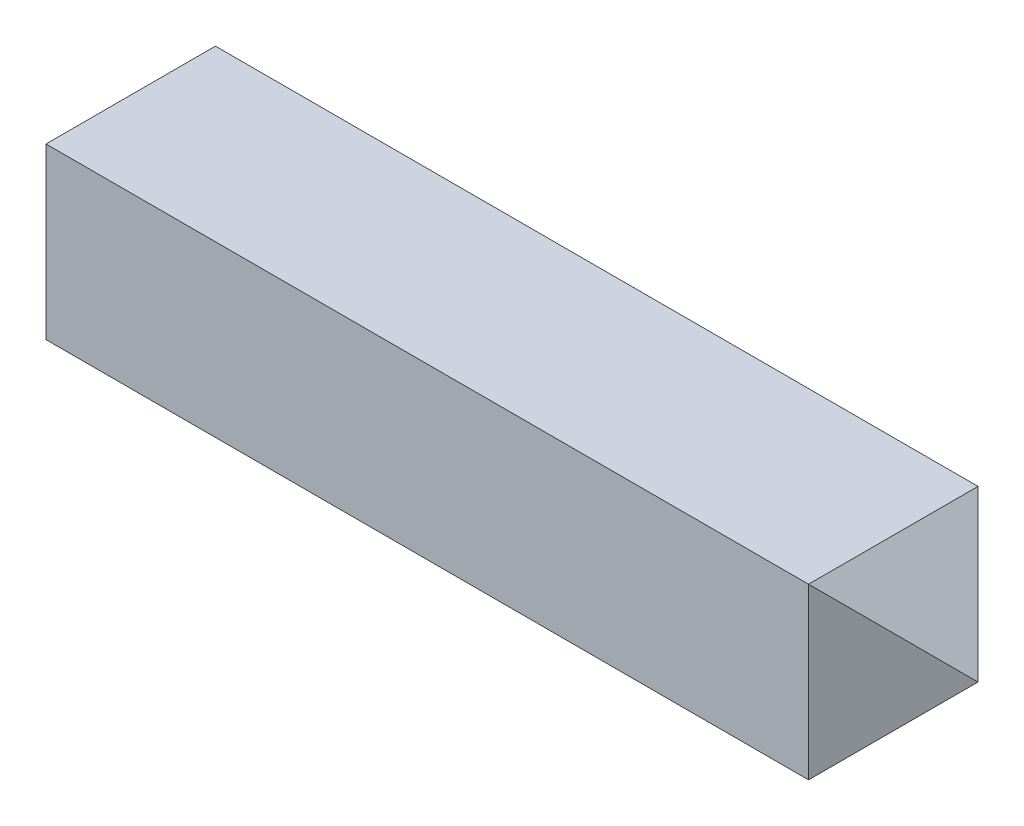
ISO-10303-21;
HEADER;
FILE_DESCRIPTION(('STEP AP214'),'2;1');
FILE_NAME('part.step','',(''),(''),'','','');
FILE_SCHEMA(('AUTOMOTIVE_DESIGN { 1 0 10303 214 1 1 1 1 }'));
ENDSEC;
DATA;
#1=APPLICATION_CONTEXT('core data for automotive mechanical design processes');
#2=APPLICATION_PROTOCOL_DEFINITION('international standard','automotive_design',2000,#1);
#3=PRODUCT_CONTEXT('',#1,'mechanical');
#4=PRODUCT('Part','Part','',(#3));
#5=PRODUCT_RELATED_PRODUCT_CATEGORY('part','',(#4));
#6=PRODUCT_DEFINITION_FORMATION('','',#4);
#7=PRODUCT_DEFINITION_CONTEXT('part definition',#1,'design');
#8=PRODUCT_DEFINITION('design','',#6,#7);
#9=PRODUCT_DEFINITION_SHAPE('','',#8);
#10=(LENGTH_UNIT() NAMED_UNIT(*) SI_UNIT(.MILLI.,.METRE.));
#11=(NAMED_UNIT(*) PLANE_ANGLE_UNIT() SI_UNIT($,.RADIAN.));
#12=(NAMED_UNIT(*) SI_UNIT($,.STERADIAN.) SOLID_ANGLE_UNIT());
#13=UNCERTAINTY_MEASURE_WITH_UNIT(LENGTH_MEASURE(1.E-05),#10,'distance_accuracy_value','');
#14=(GEOMETRIC_REPRESENTATION_CONTEXT(3) GLOBAL_UNCERTAINTY_ASSIGNED_CONTEXT((#13)) GLOBAL_UNIT_ASSIGNED_CONTEXT((#10,
#11,#12)) REPRESENTATION_CONTEXT('',''));
#15=CARTESIAN_POINT('',(0.,0.,0.));
#16=DIRECTION('',(0.,0.,1.));
#17=DIRECTION('',(1.,0.,0.));
#18=AXIS2_PLACEMENT_3D('',#15,#16,#17);
#19=CARTESIAN_POINT('',(100.,-10.,-10.));
#20=DIRECTION('',(0.,0.,1.));
#21=DIRECTION('',(1.,0.,0.));
#22=AXIS2_PLACEMENT_3D('',#19,#20,#21);
#23=PLANE('',#22);
#24=DIRECTION('',(-1.,0.,0.));
#25=VECTOR('',#24,1.);
#26=CARTESIAN_POINT('',(100.,10.,-10.));
#27=LINE('',#26,#25);
#28=CARTESIAN_POINT('',(90.,10.,-10.));
#29=VERTEX_POINT('',#28);
#30=CARTESIAN_POINT('',(0.,10.,-10.));
#31=VERTEX_POINT('',#30);
#32=EDGE_CURVE('E52',#29,#31,#27,.T.);
#33=ORIENTED_EDGE('',*,*,#32,.F.);
#34=DIRECTION('',(0.,1.,0.));
#35=VECTOR('',#34,1.);
#36=CARTESIAN_POINT('',(90.,-23.9999999999999,-10.));
#37=LINE('',#36,#35);
#38=CARTESIAN_POINT('',(90.,-10.,-10.));
#39=VERTEX_POINT('',#38);
#40=EDGE_CURVE('E101',#39,#29,#37,.T.);
#41=ORIENTED_EDGE('',*,*,#40,.F.);
#42=DIRECTION('',(-1.,0.,0.));
#43=VECTOR('',#42,1.);
#44=CARTESIAN_POINT('',(100.,-10.,-10.));
#45=LINE('',#44,#43);
#46=CARTESIAN_POINT('',(0.,-10.,-10.));
#47=VERTEX_POINT('',#46);
#48=EDGE_CURVE('E59',#39,#47,#45,.T.);
#49=ORIENTED_EDGE('',*,*,#48,.T.);
#50=DIRECTION('',(0.,1.,0.));
#51=VECTOR('',#50,1.);
#52=CARTESIAN_POINT('',(0.,-10.,-10.));
#53=LINE('',#52,#51);
#54=EDGE_CURVE('E117',#47,#31,#53,.T.);
#55=ORIENTED_EDGE('',*,*,#54,.T.);
#56=EDGE_LOOP('',(#33,#41,#49,#55));
#57=FACE_BOUND('',#56,.T.);
#58=ADVANCED_FACE('F44',(#57),#23,.F.);
#59=CARTESIAN_POINT('',(100.,10.,10.));
#60=DIRECTION('',(0.,-1.,0.));
#61=DIRECTION('',(0.,0.,-1.));
#62=AXIS2_PLACEMENT_3D('',#59,#60,#61);
#63=PLANE('',#62);
#64=DIRECTION('',(-1.,0.,0.));
#65=VECTOR('',#64,1.);
#66=CARTESIAN_POINT('',(100.,10.,10.));
#67=LINE('',#66,#65);
#68=CARTESIAN_POINT('',(90.,10.,10.));
#69=VERTEX_POINT('',#68);
#70=CARTESIAN_POINT('',(0.,10.,10.));
#71=VERTEX_POINT('',#70);
#72=EDGE_CURVE('E106',#69,#71,#67,.T.);
#73=ORIENTED_EDGE('',*,*,#72,.F.);
#74=DIRECTION('',(0.,0.,1.));
#75=VECTOR('',#74,1.);
#76=CARTESIAN_POINT('',(90.,10.,-23.9999999999999));
#77=LINE('',#76,#75);
#78=EDGE_CURVE('E111',#29,#69,#77,.T.);
#79=ORIENTED_EDGE('',*,*,#78,.F.);
#80=ORIENTED_EDGE('',*,*,#32,.T.);
#81=DIRECTION('',(0.,0.,1.));
#82=VECTOR('',#81,1.);
#83=CARTESIAN_POINT('',(0.,10.,10.));
#84=LINE('',#83,#82);
#85=EDGE_CURVE('E122',#31,#71,#84,.T.);
#86=ORIENTED_EDGE('',*,*,#85,.T.);
#87=EDGE_LOOP('',(#73,#79,#80,#86));
#88=FACE_BOUND('',#87,.T.);
#89=ADVANCED_FACE('F120',(#88),#63,.F.);
#90=CARTESIAN_POINT('',(100.,-10.,10.));
#91=DIRECTION('',(0.,0.,-1.));
#92=DIRECTION('',(-1.,0.,0.));
#93=AXIS2_PLACEMENT_3D('',#90,#91,#92);
#94=PLANE('',#93);
#95=DIRECTION('',(-1.,0.,0.));
#96=VECTOR('',#95,1.);
#97=CARTESIAN_POINT('',(100.,-10.,10.));
#98=LINE('',#97,#96);
#99=CARTESIAN_POINT('',(90.,-10.,10.));
#100=VERTEX_POINT('',#99);
#101=CARTESIAN_POINT('',(0.,-10.,10.));
#102=VERTEX_POINT('',#101);
#103=EDGE_CURVE('E66',#100,#102,#98,.T.);
#104=ORIENTED_EDGE('',*,*,#103,.F.);
#105=DIRECTION('',(0.,1.,0.));
#106=VECTOR('',#105,1.);
#107=CARTESIAN_POINT('',(90.,-23.9999999999999,10.));
#108=LINE('',#107,#106);
#109=EDGE_CURVE('E93',#100,#69,#108,.T.);
#110=ORIENTED_EDGE('',*,*,#109,.T.);
#111=ORIENTED_EDGE('',*,*,#72,.T.);
#112=DIRECTION('',(0.,-1.,0.));
#113=VECTOR('',#112,1.);
#114=CARTESIAN_POINT('',(0.,-10.,10.));
#115=LINE('',#114,#113);
#116=EDGE_CURVE('E135',#71,#102,#115,.T.);
#117=ORIENTED_EDGE('',*,*,#116,.T.);
#118=EDGE_LOOP('',(#104,#110,#111,#117));
#119=FACE_BOUND('',#118,.T.);
#120=ADVANCED_FACE('F104',(#119),#94,.F.);
#121=CARTESIAN_POINT('',(100.,-10.,10.));
#122=DIRECTION('',(0.,1.,0.));
#123=DIRECTION('',(0.,0.,1.));
#124=AXIS2_PLACEMENT_3D('',#121,#122,#123);
#125=PLANE('',#124);
#126=ORIENTED_EDGE('',*,*,#48,.F.);
#127=DIRECTION('',(0.,0.,1.));
#128=VECTOR('',#127,1.);
#129=CARTESIAN_POINT('',(90.,-10.,-23.9999999999999));
#130=LINE('',#129,#128);
#131=EDGE_CURVE('E118',#39,#100,#130,.T.);
#132=ORIENTED_EDGE('',*,*,#131,.T.);
#133=ORIENTED_EDGE('',*,*,#103,.T.);
#134=DIRECTION('',(0.,0.,-1.));
#135=VECTOR('',#134,1.);
#136=CARTESIAN_POINT('',(0.,-10.,10.));
#137=LINE('',#136,#135);
#138=EDGE_CURVE('E132',#102,#47,#137,.T.);
#139=ORIENTED_EDGE('',*,*,#138,.T.);
#140=EDGE_LOOP('',(#126,#132,#133,#139));
#141=FACE_BOUND('',#140,.T.);
#142=ADVANCED_FACE('F152',(#141),#125,.F.);
#143=CARTESIAN_POINT('',(0.,0.,0.));
#144=DIRECTION('',(-1.,0.,0.));
#145=DIRECTION('',(0.,0.,1.));
#146=AXIS2_PLACEMENT_3D('',#143,#144,#145);
#147=PLANE('',#146);
#148=ORIENTED_EDGE('',*,*,#54,.F.);
#149=ORIENTED_EDGE('',*,*,#138,.F.);
#150=ORIENTED_EDGE('',*,*,#116,.F.);
#151=ORIENTED_EDGE('',*,*,#85,.F.);
#152=EDGE_LOOP('',(#148,#149,#150,#151));
#153=FACE_BOUND('',#152,.T.);
#154=ADVANCED_FACE('F156',(#153),#147,.T.);
#155=CARTESIAN_POINT('',(90.,10.,-23.9999999999999));
#156=DIRECTION('',(-0.707106781186548,-0.707106781186547,0.));
#157=DIRECTION('',(0.707106781186547,-0.707106781186548,0.));
#158=AXIS2_PLACEMENT_3D('',#155,#156,#157);
#159=PLANE('',#158);
#160=ORIENTED_EDGE('',*,*,#78,.T.);
#161=DIRECTION('',(0.577350269189626,-0.577350269189626,-0.577350269189626));
#162=VECTOR('',#161,1.);
#163=CARTESIAN_POINT('',(101.333333333333,-1.33333333333331,-1.33333333333332));
#164=LINE('',#163,#162);
#165=CARTESIAN_POINT('',(100.,0.,0.));
#166=VERTEX_POINT('',#165);
#167=EDGE_CURVE('E90',#69,#166,#164,.T.);
#168=ORIENTED_EDGE('',*,*,#167,.T.);
#169=DIRECTION('',(-0.577350269189626,0.577350269189626,-0.577350269189626));
#170=VECTOR('',#169,1.);
#171=CARTESIAN_POINT('',(85.3333333333334,14.6666666666667,-14.6666666666666));
#172=LINE('',#171,#170);
#173=EDGE_CURVE('E113',#166,#29,#172,.T.);
#174=ORIENTED_EDGE('',*,*,#173,.T.);
#175=EDGE_LOOP('',(#160,#168,#174));
#176=FACE_BOUND('',#175,.T.);
#177=ADVANCED_FACE('F112',(#176),#159,.F.);
#178=CARTESIAN_POINT('',(90.,-10.,-23.9999999999999));
#179=DIRECTION('',(-0.707106781186548,0.707106781186547,0.));
#180=DIRECTION('',(-0.707106781186547,-0.707106781186548,0.));
#181=AXIS2_PLACEMENT_3D('',#178,#179,#180);
#182=PLANE('',#181);
#183=DIRECTION('',(0.577350269189626,0.577350269189626,0.577350269189626));
#184=VECTOR('',#183,1.);
#185=CARTESIAN_POINT('',(85.3333333333334,-14.6666666666667,-14.6666666666666));
#186=LINE('',#185,#184);
#187=EDGE_CURVE('E12',#39,#166,#186,.T.);
#188=ORIENTED_EDGE('',*,*,#187,.T.);
#189=DIRECTION('',(-0.577350269189626,-0.577350269189626,0.577350269189626));
#190=VECTOR('',#189,1.);
#191=CARTESIAN_POINT('',(101.333333333333,1.33333333333331,-1.33333333333332));
#192=LINE('',#191,#190);
#193=EDGE_CURVE('E95',#166,#100,#192,.T.);
#194=ORIENTED_EDGE('',*,*,#193,.T.);
#195=ORIENTED_EDGE('',*,*,#131,.F.);
#196=EDGE_LOOP('',(#188,#194,#195));
#197=FACE_BOUND('',#196,.T.);
#198=ADVANCED_FACE('F151',(#197),#182,.F.);
#199=CARTESIAN_POINT('',(50.,-23.9999999999999,-50.));
#200=DIRECTION('',(-0.707106781186548,0.,0.707106781186548));
#201=DIRECTION('',(0.707106781186548,0.,0.707106781186548));
#202=AXIS2_PLACEMENT_3D('',#199,#200,#201);
#203=PLANE('',#202);
#204=ORIENTED_EDGE('',*,*,#187,.F.);
#205=ORIENTED_EDGE('',*,*,#40,.T.);
#206=ORIENTED_EDGE('',*,*,#173,.F.);
#207=EDGE_LOOP('',(#204,#205,#206));
#208=FACE_BOUND('',#207,.T.);
#209=ADVANCED_FACE('F158',(#208),#203,.F.);
#210=CARTESIAN_POINT('',(50.,-23.9999999999999,50.));
#211=DIRECTION('',(-0.707106781186548,0.,-0.707106781186547));
#212=DIRECTION('',(-0.707106781186547,0.,0.707106781186548));
#213=AXIS2_PLACEMENT_3D('',#210,#211,#212);
#214=PLANE('',#213);
#215=ORIENTED_EDGE('',*,*,#109,.F.);
#216=ORIENTED_EDGE('',*,*,#193,.F.);
#217=ORIENTED_EDGE('',*,*,#167,.F.);
#218=EDGE_LOOP('',(#215,#216,#217));
#219=FACE_BOUND('',#218,.T.);
#220=ADVANCED_FACE('F92',(#219),#214,.F.);
#221=CLOSED_SHELL('',(#58,#89,#120,#142,#154,#177,#198,#209,#220));
#222=MANIFOLD_SOLID_BREP('B2',#221);
#223=ADVANCED_BREP_SHAPE_REPRESENTATION('',(#18,#222),#14);
#224=SHAPE_DEFINITION_REPRESENTATION(#9,#223);
ENDSEC;
END-ISO-10303-21;
